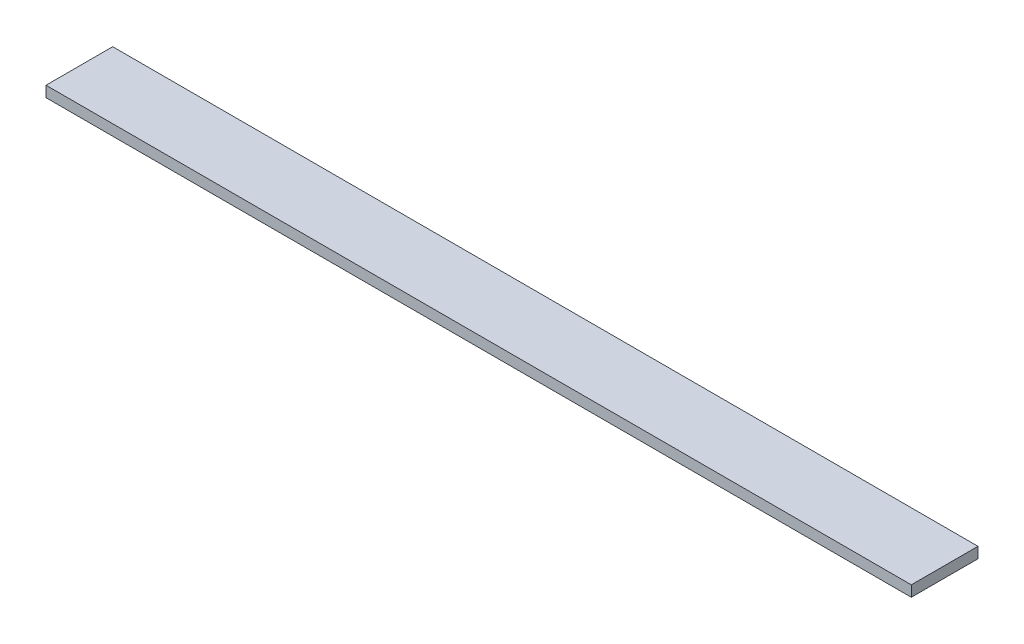
ISO-10303-21;
HEADER;
FILE_DESCRIPTION(('STEP AP214'),'2;1');
FILE_NAME('part.step','',(''),(''),'','','');
FILE_SCHEMA(('AUTOMOTIVE_DESIGN { 1 0 10303 214 1 1 1 1 }'));
ENDSEC;
DATA;
#1=APPLICATION_CONTEXT('core data for automotive mechanical design processes');
#2=APPLICATION_PROTOCOL_DEFINITION('international standard','automotive_design',2000,#1);
#3=PRODUCT_CONTEXT('',#1,'mechanical');
#4=PRODUCT('Part','Part','',(#3));
#5=PRODUCT_RELATED_PRODUCT_CATEGORY('part','',(#4));
#6=PRODUCT_DEFINITION_FORMATION('','',#4);
#7=PRODUCT_DEFINITION_CONTEXT('part definition',#1,'design');
#8=PRODUCT_DEFINITION('design','',#6,#7);
#9=PRODUCT_DEFINITION_SHAPE('','',#8);
#10=(LENGTH_UNIT() NAMED_UNIT(*) SI_UNIT(.MILLI.,.METRE.));
#11=(NAMED_UNIT(*) PLANE_ANGLE_UNIT() SI_UNIT($,.RADIAN.));
#12=(NAMED_UNIT(*) SI_UNIT($,.STERADIAN.) SOLID_ANGLE_UNIT());
#13=UNCERTAINTY_MEASURE_WITH_UNIT(LENGTH_MEASURE(1.E-05),#10,'distance_accuracy_value','');
#14=(GEOMETRIC_REPRESENTATION_CONTEXT(3) GLOBAL_UNCERTAINTY_ASSIGNED_CONTEXT((#13)) GLOBAL_UNIT_ASSIGNED_CONTEXT((#10,
#11,#12)) REPRESENTATION_CONTEXT('',''));
#15=CARTESIAN_POINT('',(0.,0.,0.));
#16=DIRECTION('',(0.,0.,1.));
#17=DIRECTION('',(1.,0.,0.));
#18=AXIS2_PLACEMENT_3D('',#15,#16,#17);
#19=CARTESIAN_POINT('',(-1312.25594149909,38.1,-579.510054844607));
#20=DIRECTION('',(1.,0.,0.));
#21=DIRECTION('',(0.,0.,-1.));
#22=AXIS2_PLACEMENT_3D('',#19,#20,#21);
#23=PLANE('',#22);
#24=DIRECTION('',(0.,0.,1.));
#25=VECTOR('',#24,1.);
#26=CARTESIAN_POINT('',(-1312.25594149909,0.,-579.510054844607));
#27=LINE('',#26,#25);
#28=CARTESIAN_POINT('',(-1312.25594149909,0.,-579.510054844607));
#29=VERTEX_POINT('',#28);
#30=CARTESIAN_POINT('',(-1312.25594149909,0.,-344.560054844607));
#31=VERTEX_POINT('',#30);
#32=EDGE_CURVE('E96',#29,#31,#27,.T.);
#33=ORIENTED_EDGE('',*,*,#32,.T.);
#34=DIRECTION('',(0.,-1.,0.));
#35=VECTOR('',#34,1.);
#36=CARTESIAN_POINT('',(-1312.25594149909,38.1,-344.560054844607));
#37=LINE('',#36,#35);
#38=CARTESIAN_POINT('',(-1312.25594149909,38.1,-344.560054844607));
#39=VERTEX_POINT('',#38);
#40=EDGE_CURVE('E11',#39,#31,#37,.T.);
#41=ORIENTED_EDGE('',*,*,#40,.F.);
#42=DIRECTION('',(0.,0.,1.));
#43=VECTOR('',#42,1.);
#44=CARTESIAN_POINT('',(-1312.25594149909,38.1,-579.510054844607));
#45=LINE('',#44,#43);
#46=CARTESIAN_POINT('',(-1312.25594149909,38.1,-579.510054844607));
#47=VERTEX_POINT('',#46);
#48=EDGE_CURVE('E84',#47,#39,#45,.T.);
#49=ORIENTED_EDGE('',*,*,#48,.F.);
#50=DIRECTION('',(0.,-1.,0.));
#51=VECTOR('',#50,1.);
#52=CARTESIAN_POINT('',(-1312.25594149909,38.1,-579.510054844607));
#53=LINE('',#52,#51);
#54=EDGE_CURVE('E92',#47,#29,#53,.T.);
#55=ORIENTED_EDGE('',*,*,#54,.T.);
#56=EDGE_LOOP('',(#33,#41,#49,#55));
#57=FACE_BOUND('',#56,.T.);
#58=ADVANCED_FACE('F33',(#57),#23,.F.);
#59=CARTESIAN_POINT('',(-1312.25594149909,38.1,-344.560054844607));
#60=DIRECTION('',(0.,0.,-1.));
#61=DIRECTION('',(-1.,0.,0.));
#62=AXIS2_PLACEMENT_3D('',#59,#60,#61);
#63=PLANE('',#62);
#64=DIRECTION('',(1.,0.,0.));
#65=VECTOR('',#64,1.);
#66=CARTESIAN_POINT('',(-1312.25594149909,0.,-344.560054844607));
#67=LINE('',#66,#65);
#68=CARTESIAN_POINT('',(1735.74405850091,0.,-344.560054844607));
#69=VERTEX_POINT('',#68);
#70=EDGE_CURVE('E88',#31,#69,#67,.T.);
#71=ORIENTED_EDGE('',*,*,#70,.T.);
#72=DIRECTION('',(0.,-1.,0.));
#73=VECTOR('',#72,1.);
#74=CARTESIAN_POINT('',(1735.74405850091,38.1,-344.560054844607));
#75=LINE('',#74,#73);
#76=CARTESIAN_POINT('',(1735.74405850091,38.1,-344.560054844607));
#77=VERTEX_POINT('',#76);
#78=EDGE_CURVE('E41',#77,#69,#75,.T.);
#79=ORIENTED_EDGE('',*,*,#78,.F.);
#80=DIRECTION('',(1.,0.,0.));
#81=VECTOR('',#80,1.);
#82=CARTESIAN_POINT('',(-1312.25594149909,38.1,-344.560054844607));
#83=LINE('',#82,#81);
#84=EDGE_CURVE('E79',#39,#77,#83,.T.);
#85=ORIENTED_EDGE('',*,*,#84,.F.);
#86=ORIENTED_EDGE('',*,*,#40,.T.);
#87=EDGE_LOOP('',(#71,#79,#85,#86));
#88=FACE_BOUND('',#87,.T.);
#89=ADVANCED_FACE('F87',(#88),#63,.F.);
#90=CARTESIAN_POINT('',(1735.74405850091,38.1,-579.510054844607));
#91=DIRECTION('',(-1.,0.,0.));
#92=DIRECTION('',(0.,0.,1.));
#93=AXIS2_PLACEMENT_3D('',#90,#91,#92);
#94=PLANE('',#93);
#95=DIRECTION('',(0.,0.,-1.));
#96=VECTOR('',#95,1.);
#97=CARTESIAN_POINT('',(1735.74405850091,0.,-579.510054844607));
#98=LINE('',#97,#96);
#99=CARTESIAN_POINT('',(1735.74405850091,0.,-579.510054844607));
#100=VERTEX_POINT('',#99);
#101=EDGE_CURVE('E66',#69,#100,#98,.T.);
#102=ORIENTED_EDGE('',*,*,#101,.T.);
#103=DIRECTION('',(0.,-1.,0.));
#104=VECTOR('',#103,1.);
#105=CARTESIAN_POINT('',(1735.74405850091,38.1,-579.510054844607));
#106=LINE('',#105,#104);
#107=CARTESIAN_POINT('',(1735.74405850091,38.1,-579.510054844607));
#108=VERTEX_POINT('',#107);
#109=EDGE_CURVE('E89',#108,#100,#106,.T.);
#110=ORIENTED_EDGE('',*,*,#109,.F.);
#111=DIRECTION('',(0.,0.,-1.));
#112=VECTOR('',#111,1.);
#113=CARTESIAN_POINT('',(1735.74405850091,38.1,-579.510054844607));
#114=LINE('',#113,#112);
#115=EDGE_CURVE('E82',#77,#108,#114,.T.);
#116=ORIENTED_EDGE('',*,*,#115,.F.);
#117=ORIENTED_EDGE('',*,*,#78,.T.);
#118=EDGE_LOOP('',(#102,#110,#116,#117));
#119=FACE_BOUND('',#118,.T.);
#120=ADVANCED_FACE('F90',(#119),#94,.F.);
#121=CARTESIAN_POINT('',(-1312.25594149909,38.1,-579.510054844607));
#122=DIRECTION('',(0.,0.,1.));
#123=DIRECTION('',(1.,0.,0.));
#124=AXIS2_PLACEMENT_3D('',#121,#122,#123);
#125=PLANE('',#124);
#126=DIRECTION('',(-1.,0.,0.));
#127=VECTOR('',#126,1.);
#128=CARTESIAN_POINT('',(-1312.25594149909,0.,-579.510054844607));
#129=LINE('',#128,#127);
#130=EDGE_CURVE('E72',#100,#29,#129,.T.);
#131=ORIENTED_EDGE('',*,*,#130,.T.);
#132=ORIENTED_EDGE('',*,*,#54,.F.);
#133=DIRECTION('',(-1.,0.,0.));
#134=VECTOR('',#133,1.);
#135=CARTESIAN_POINT('',(-1312.25594149909,38.1,-579.510054844607));
#136=LINE('',#135,#134);
#137=EDGE_CURVE('E49',#108,#47,#136,.T.);
#138=ORIENTED_EDGE('',*,*,#137,.F.);
#139=ORIENTED_EDGE('',*,*,#109,.T.);
#140=EDGE_LOOP('',(#131,#132,#138,#139));
#141=FACE_BOUND('',#140,.T.);
#142=ADVANCED_FACE('F103',(#141),#125,.F.);
#143=CARTESIAN_POINT('',(0.,38.1,0.));
#144=DIRECTION('',(0.,1.,0.));
#145=DIRECTION('',(0.,0.,1.));
#146=AXIS2_PLACEMENT_3D('',#143,#144,#145);
#147=PLANE('',#146);
#148=ORIENTED_EDGE('',*,*,#48,.T.);
#149=ORIENTED_EDGE('',*,*,#84,.T.);
#150=ORIENTED_EDGE('',*,*,#115,.T.);
#151=ORIENTED_EDGE('',*,*,#137,.T.);
#152=EDGE_LOOP('',(#148,#149,#150,#151));
#153=FACE_BOUND('',#152,.T.);
#154=ADVANCED_FACE('F80',(#153),#147,.T.);
#155=CARTESIAN_POINT('',(0.,0.,0.));
#156=DIRECTION('',(0.,1.,0.));
#157=DIRECTION('',(0.,0.,1.));
#158=AXIS2_PLACEMENT_3D('',#155,#156,#157);
#159=PLANE('',#158);
#160=ORIENTED_EDGE('',*,*,#32,.F.);
#161=ORIENTED_EDGE('',*,*,#130,.F.);
#162=ORIENTED_EDGE('',*,*,#101,.F.);
#163=ORIENTED_EDGE('',*,*,#70,.F.);
#164=EDGE_LOOP('',(#160,#161,#162,#163));
#165=FACE_BOUND('',#164,.T.);
#166=ADVANCED_FACE('F106',(#165),#159,.F.);
#167=CLOSED_SHELL('',(#58,#89,#120,#142,#154,#166));
#168=MANIFOLD_SOLID_BREP('B2',#167);
#169=ADVANCED_BREP_SHAPE_REPRESENTATION('',(#18,#168),#14);
#170=SHAPE_DEFINITION_REPRESENTATION(#9,#169);
ENDSEC;
END-ISO-10303-21;
